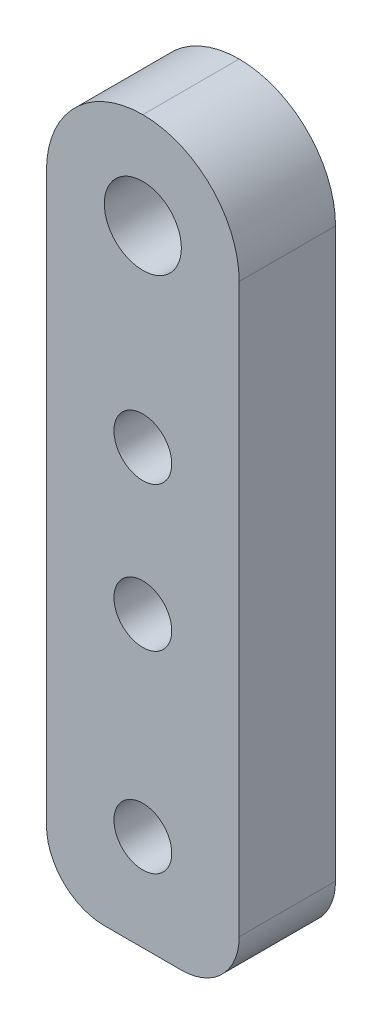
ISO-10303-21;
HEADER;
FILE_DESCRIPTION(('STEP AP214'),'2;1');
FILE_NAME('part.step','',(''),(''),'','','');
FILE_SCHEMA(('AUTOMOTIVE_DESIGN { 1 0 10303 214 1 1 1 1 }'));
ENDSEC;
DATA;
#1=APPLICATION_CONTEXT('core data for automotive mechanical design processes');
#2=APPLICATION_PROTOCOL_DEFINITION('international standard','automotive_design',2000,#1);
#3=PRODUCT_CONTEXT('',#1,'mechanical');
#4=PRODUCT('Part','Part','',(#3));
#5=PRODUCT_RELATED_PRODUCT_CATEGORY('part','',(#4));
#6=PRODUCT_DEFINITION_FORMATION('','',#4);
#7=PRODUCT_DEFINITION_CONTEXT('part definition',#1,'design');
#8=PRODUCT_DEFINITION('design','',#6,#7);
#9=PRODUCT_DEFINITION_SHAPE('','',#8);
#10=(LENGTH_UNIT() NAMED_UNIT(*) SI_UNIT(.MILLI.,.METRE.));
#11=(NAMED_UNIT(*) PLANE_ANGLE_UNIT() SI_UNIT($,.RADIAN.));
#12=(NAMED_UNIT(*) SI_UNIT($,.STERADIAN.) SOLID_ANGLE_UNIT());
#13=UNCERTAINTY_MEASURE_WITH_UNIT(LENGTH_MEASURE(1.E-05),#10,'distance_accuracy_value','');
#14=(GEOMETRIC_REPRESENTATION_CONTEXT(3) GLOBAL_UNCERTAINTY_ASSIGNED_CONTEXT((#13)) GLOBAL_UNIT_ASSIGNED_CONTEXT((#10,
#11,#12)) REPRESENTATION_CONTEXT('',''));
#15=CARTESIAN_POINT('',(0.,0.,0.));
#16=DIRECTION('',(0.,0.,1.));
#17=DIRECTION('',(1.,0.,0.));
#18=AXIS2_PLACEMENT_3D('',#15,#16,#17);
#19=CARTESIAN_POINT('',(0.,0.,5.));
#20=DIRECTION('',(0.,0.,-1.));
#21=DIRECTION('',(-1.,0.,0.));
#22=AXIS2_PLACEMENT_3D('',#19,#20,#21);
#23=PLANE('',#22);
#24=DIRECTION('',(0.,-1.,0.));
#25=VECTOR('',#24,1.);
#26=CARTESIAN_POINT('',(-5.,-18.725,5.));
#27=LINE('',#26,#25);
#28=CARTESIAN_POINT('',(-5.,13.725,5.));
#29=VERTEX_POINT('',#28);
#30=CARTESIAN_POINT('',(-5.,-15.725,5.));
#31=VERTEX_POINT('',#30);
#32=EDGE_CURVE('E118',#29,#31,#27,.T.);
#33=ORIENTED_EDGE('',*,*,#32,.T.);
#34=CARTESIAN_POINT('',(-2.,-15.725,5.));
#35=DIRECTION('',(0.,0.,-1.));
#36=DIRECTION('',(-1.,0.,0.));
#37=AXIS2_PLACEMENT_3D('',#34,#35,#36);
#38=CIRCLE('',#37,3.);
#39=CARTESIAN_POINT('',(-2.,-18.725,5.));
#40=VERTEX_POINT('',#39);
#41=EDGE_CURVE('E48',#31,#40,#38,.F.);
#42=ORIENTED_EDGE('',*,*,#41,.T.);
#43=DIRECTION('',(1.,0.,0.));
#44=VECTOR('',#43,1.);
#45=CARTESIAN_POINT('',(-5.,-18.725,5.));
#46=LINE('',#45,#44);
#47=CARTESIAN_POINT('',(2.,-18.725,5.));
#48=VERTEX_POINT('',#47);
#49=EDGE_CURVE('E119',#40,#48,#46,.T.);
#50=ORIENTED_EDGE('',*,*,#49,.T.);
#51=CARTESIAN_POINT('',(2.,-15.725,5.));
#52=DIRECTION('',(0.,0.,-1.));
#53=DIRECTION('',(-1.,0.,0.));
#54=AXIS2_PLACEMENT_3D('',#51,#52,#53);
#55=CIRCLE('',#54,3.);
#56=CARTESIAN_POINT('',(5.,-15.725,5.));
#57=VERTEX_POINT('',#56);
#58=EDGE_CURVE('E55',#48,#57,#55,.F.);
#59=ORIENTED_EDGE('',*,*,#58,.T.);
#60=DIRECTION('',(0.,1.,0.));
#61=VECTOR('',#60,1.);
#62=CARTESIAN_POINT('',(5.,-18.725,5.));
#63=LINE('',#62,#61);
#64=CARTESIAN_POINT('',(5.,13.725,5.));
#65=VERTEX_POINT('',#64);
#66=EDGE_CURVE('E129',#57,#65,#63,.T.);
#67=ORIENTED_EDGE('',*,*,#66,.T.);
#68=CARTESIAN_POINT('',(0.,13.725,5.));
#69=DIRECTION('',(0.,0.,-1.));
#70=DIRECTION('',(-1.,0.,0.));
#71=AXIS2_PLACEMENT_3D('',#68,#69,#70);
#72=CIRCLE('',#71,5.);
#73=CARTESIAN_POINT('',(0.,18.725,5.));
#74=VERTEX_POINT('',#73);
#75=EDGE_CURVE('E113',#65,#74,#72,.F.);
#76=ORIENTED_EDGE('',*,*,#75,.T.);
#77=CARTESIAN_POINT('',(0.,13.725,5.));
#78=DIRECTION('',(0.,0.,-1.));
#79=DIRECTION('',(-1.,0.,0.));
#80=AXIS2_PLACEMENT_3D('',#77,#78,#79);
#81=CIRCLE('',#80,5.);
#82=EDGE_CURVE('E138',#74,#29,#81,.F.);
#83=ORIENTED_EDGE('',*,*,#82,.T.);
#84=EDGE_LOOP('',(#33,#42,#50,#59,#67,#76,#83));
#85=FACE_BOUND('',#84,.T.);
#86=CARTESIAN_POINT('',(0.,-13.725,5.));
#87=DIRECTION('',(0.,0.,1.));
#88=DIRECTION('',(1.,0.,0.));
#89=AXIS2_PLACEMENT_3D('',#86,#87,#88);
#90=CIRCLE('',#89,1.5);
#91=CARTESIAN_POINT('',(1.5,-13.725,5.));
#92=VERTEX_POINT('',#91);
#93=EDGE_CURVE('E131',#92,#92,#90,.T.);
#94=ORIENTED_EDGE('',*,*,#93,.F.);
#95=EDGE_LOOP('',(#94));
#96=FACE_BOUND('',#95,.T.);
#97=CARTESIAN_POINT('',(0.,-3.725,5.));
#98=DIRECTION('',(0.,0.,1.));
#99=DIRECTION('',(1.,0.,0.));
#100=AXIS2_PLACEMENT_3D('',#97,#98,#99);
#101=CIRCLE('',#100,1.5);
#102=CARTESIAN_POINT('',(1.5,-3.725,5.));
#103=VERTEX_POINT('',#102);
#104=EDGE_CURVE('E228',#103,#103,#101,.T.);
#105=ORIENTED_EDGE('',*,*,#104,.F.);
#106=EDGE_LOOP('',(#105));
#107=FACE_BOUND('',#106,.T.);
#108=CARTESIAN_POINT('',(0.,13.725,5.));
#109=DIRECTION('',(0.,0.,1.));
#110=DIRECTION('',(1.,0.,0.));
#111=AXIS2_PLACEMENT_3D('',#108,#109,#110);
#112=CIRCLE('',#111,2.);
#113=CARTESIAN_POINT('',(2.,13.725,5.));
#114=VERTEX_POINT('',#113);
#115=EDGE_CURVE('E229',#114,#114,#112,.T.);
#116=ORIENTED_EDGE('',*,*,#115,.F.);
#117=EDGE_LOOP('',(#116));
#118=FACE_BOUND('',#117,.T.);
#119=CARTESIAN_POINT('',(0.,3.775,5.));
#120=DIRECTION('',(0.,0.,1.));
#121=DIRECTION('',(1.,0.,0.));
#122=AXIS2_PLACEMENT_3D('',#119,#120,#121);
#123=CIRCLE('',#122,1.5);
#124=CARTESIAN_POINT('',(1.5,3.775,5.));
#125=VERTEX_POINT('',#124);
#126=EDGE_CURVE('E237',#125,#125,#123,.T.);
#127=ORIENTED_EDGE('',*,*,#126,.F.);
#128=EDGE_LOOP('',(#127));
#129=FACE_BOUND('',#128,.T.);
#130=ADVANCED_FACE('F40',(#85,#96,#107,#118,#129),#23,.F.);
#131=CARTESIAN_POINT('',(0.,0.,0.));
#132=DIRECTION('',(0.,0.,-1.));
#133=DIRECTION('',(-1.,0.,0.));
#134=AXIS2_PLACEMENT_3D('',#131,#132,#133);
#135=PLANE('',#134);
#136=CARTESIAN_POINT('',(0.,13.725,0.));
#137=DIRECTION('',(0.,0.,1.));
#138=DIRECTION('',(1.,0.,0.));
#139=AXIS2_PLACEMENT_3D('',#136,#137,#138);
#140=CIRCLE('',#139,2.);
#141=CARTESIAN_POINT('',(2.,13.725,0.));
#142=VERTEX_POINT('',#141);
#143=EDGE_CURVE('E234',#142,#142,#140,.T.);
#144=ORIENTED_EDGE('',*,*,#143,.T.);
#145=EDGE_LOOP('',(#144));
#146=FACE_BOUND('',#145,.T.);
#147=CARTESIAN_POINT('',(0.,-13.725,0.));
#148=DIRECTION('',(0.,0.,1.));
#149=DIRECTION('',(1.,0.,0.));
#150=AXIS2_PLACEMENT_3D('',#147,#148,#149);
#151=CIRCLE('',#150,1.5);
#152=CARTESIAN_POINT('',(1.5,-13.725,0.));
#153=VERTEX_POINT('',#152);
#154=EDGE_CURVE('E213',#153,#153,#151,.T.);
#155=ORIENTED_EDGE('',*,*,#154,.T.);
#156=EDGE_LOOP('',(#155));
#157=FACE_BOUND('',#156,.T.);
#158=DIRECTION('',(1.,0.,0.));
#159=VECTOR('',#158,1.);
#160=CARTESIAN_POINT('',(-5.,-18.725,0.));
#161=LINE('',#160,#159);
#162=CARTESIAN_POINT('',(-2.,-18.725,0.));
#163=VERTEX_POINT('',#162);
#164=CARTESIAN_POINT('',(2.,-18.725,0.));
#165=VERTEX_POINT('',#164);
#166=EDGE_CURVE('E125',#163,#165,#161,.T.);
#167=ORIENTED_EDGE('',*,*,#166,.F.);
#168=CARTESIAN_POINT('',(-2.,-15.725,0.));
#169=DIRECTION('',(0.,0.,-1.));
#170=DIRECTION('',(-1.,0.,0.));
#171=AXIS2_PLACEMENT_3D('',#168,#169,#170);
#172=CIRCLE('',#171,3.);
#173=CARTESIAN_POINT('',(-5.,-15.725,0.));
#174=VERTEX_POINT('',#173);
#175=EDGE_CURVE('E124',#163,#174,#172,.T.);
#176=ORIENTED_EDGE('',*,*,#175,.T.);
#177=DIRECTION('',(0.,-1.,0.));
#178=VECTOR('',#177,1.);
#179=CARTESIAN_POINT('',(-5.,-18.725,0.));
#180=LINE('',#179,#178);
#181=CARTESIAN_POINT('',(-5.,13.725,0.));
#182=VERTEX_POINT('',#181);
#183=EDGE_CURVE('E117',#182,#174,#180,.T.);
#184=ORIENTED_EDGE('',*,*,#183,.F.);
#185=CARTESIAN_POINT('',(0.,13.725,0.));
#186=DIRECTION('',(0.,0.,-1.));
#187=DIRECTION('',(-1.,0.,0.));
#188=AXIS2_PLACEMENT_3D('',#185,#186,#187);
#189=CIRCLE('',#188,5.);
#190=CARTESIAN_POINT('',(0.,18.725,0.));
#191=VERTEX_POINT('',#190);
#192=EDGE_CURVE('E102',#182,#191,#189,.T.);
#193=ORIENTED_EDGE('',*,*,#192,.T.);
#194=CARTESIAN_POINT('',(0.,13.725,0.));
#195=DIRECTION('',(0.,0.,-1.));
#196=DIRECTION('',(-1.,0.,0.));
#197=AXIS2_PLACEMENT_3D('',#194,#195,#196);
#198=CIRCLE('',#197,5.);
#199=CARTESIAN_POINT('',(5.,13.725,0.));
#200=VERTEX_POINT('',#199);
#201=EDGE_CURVE('E114',#191,#200,#198,.T.);
#202=ORIENTED_EDGE('',*,*,#201,.T.);
#203=DIRECTION('',(0.,1.,0.));
#204=VECTOR('',#203,1.);
#205=CARTESIAN_POINT('',(5.,-18.725,0.));
#206=LINE('',#205,#204);
#207=CARTESIAN_POINT('',(5.,-15.725,0.));
#208=VERTEX_POINT('',#207);
#209=EDGE_CURVE('E126',#208,#200,#206,.T.);
#210=ORIENTED_EDGE('',*,*,#209,.F.);
#211=CARTESIAN_POINT('',(2.,-15.725,0.));
#212=DIRECTION('',(0.,0.,-1.));
#213=DIRECTION('',(-1.,0.,0.));
#214=AXIS2_PLACEMENT_3D('',#211,#212,#213);
#215=CIRCLE('',#214,3.);
#216=EDGE_CURVE('E151',#208,#165,#215,.T.);
#217=ORIENTED_EDGE('',*,*,#216,.T.);
#218=EDGE_LOOP('',(#167,#176,#184,#193,#202,#210,#217));
#219=FACE_BOUND('',#218,.T.);
#220=CARTESIAN_POINT('',(0.,-3.725,0.));
#221=DIRECTION('',(0.,0.,1.));
#222=DIRECTION('',(1.,0.,0.));
#223=AXIS2_PLACEMENT_3D('',#220,#221,#222);
#224=CIRCLE('',#223,1.5);
#225=CARTESIAN_POINT('',(1.5,-3.725,0.));
#226=VERTEX_POINT('',#225);
#227=EDGE_CURVE('E226',#226,#226,#224,.T.);
#228=ORIENTED_EDGE('',*,*,#227,.T.);
#229=EDGE_LOOP('',(#228));
#230=FACE_BOUND('',#229,.T.);
#231=CARTESIAN_POINT('',(0.,3.775,0.));
#232=DIRECTION('',(0.,0.,1.));
#233=DIRECTION('',(1.,0.,0.));
#234=AXIS2_PLACEMENT_3D('',#231,#232,#233);
#235=CIRCLE('',#234,1.5);
#236=CARTESIAN_POINT('',(1.5,3.775,0.));
#237=VERTEX_POINT('',#236);
#238=EDGE_CURVE('E146',#237,#237,#235,.T.);
#239=ORIENTED_EDGE('',*,*,#238,.T.);
#240=EDGE_LOOP('',(#239));
#241=FACE_BOUND('',#240,.T.);
#242=ADVANCED_FACE('F122',(#146,#157,#219,#230,#241),#135,.T.);
#243=CARTESIAN_POINT('',(5.,-18.725,5.));
#244=DIRECTION('',(-1.,0.,0.));
#245=DIRECTION('',(0.,-1.,0.));
#246=AXIS2_PLACEMENT_3D('',#243,#244,#245);
#247=PLANE('',#246);
#248=ORIENTED_EDGE('',*,*,#66,.F.);
#249=DIRECTION('',(0.,0.,-1.));
#250=VECTOR('',#249,1.);
#251=CARTESIAN_POINT('',(5.,-15.725,5.));
#252=LINE('',#251,#250);
#253=EDGE_CURVE('E12',#57,#208,#252,.T.);
#254=ORIENTED_EDGE('',*,*,#253,.T.);
#255=ORIENTED_EDGE('',*,*,#209,.T.);
#256=DIRECTION('',(0.,0.,-1.));
#257=VECTOR('',#256,1.);
#258=CARTESIAN_POINT('',(5.,13.725,5.));
#259=LINE('',#258,#257);
#260=EDGE_CURVE('E141',#200,#65,#259,.F.);
#261=ORIENTED_EDGE('',*,*,#260,.T.);
#262=EDGE_LOOP('',(#248,#254,#255,#261));
#263=FACE_BOUND('',#262,.T.);
#264=ADVANCED_FACE('F182',(#263),#247,.F.);
#265=CARTESIAN_POINT('',(-5.,-18.725,5.));
#266=DIRECTION('',(1.,0.,0.));
#267=DIRECTION('',(0.,0.,-1.));
#268=AXIS2_PLACEMENT_3D('',#265,#266,#267);
#269=PLANE('',#268);
#270=ORIENTED_EDGE('',*,*,#183,.T.);
#271=DIRECTION('',(0.,0.,-1.));
#272=VECTOR('',#271,1.);
#273=CARTESIAN_POINT('',(-5.,-15.725,5.));
#274=LINE('',#273,#272);
#275=EDGE_CURVE('E63',#174,#31,#274,.F.);
#276=ORIENTED_EDGE('',*,*,#275,.T.);
#277=ORIENTED_EDGE('',*,*,#32,.F.);
#278=DIRECTION('',(0.,0.,-1.));
#279=VECTOR('',#278,1.);
#280=CARTESIAN_POINT('',(-5.,13.725,5.));
#281=LINE('',#280,#279);
#282=EDGE_CURVE('E106',#29,#182,#281,.T.);
#283=ORIENTED_EDGE('',*,*,#282,.T.);
#284=EDGE_LOOP('',(#270,#276,#277,#283));
#285=FACE_BOUND('',#284,.T.);
#286=ADVANCED_FACE('F116',(#285),#269,.F.);
#287=CARTESIAN_POINT('',(-5.,-18.725,5.));
#288=DIRECTION('',(0.,1.,0.));
#289=DIRECTION('',(0.,0.,1.));
#290=AXIS2_PLACEMENT_3D('',#287,#288,#289);
#291=PLANE('',#290);
#292=ORIENTED_EDGE('',*,*,#49,.F.);
#293=DIRECTION('',(0.,0.,-1.));
#294=VECTOR('',#293,1.);
#295=CARTESIAN_POINT('',(-2.,-18.725,5.));
#296=LINE('',#295,#294);
#297=EDGE_CURVE('E148',#40,#163,#296,.T.);
#298=ORIENTED_EDGE('',*,*,#297,.T.);
#299=ORIENTED_EDGE('',*,*,#166,.T.);
#300=DIRECTION('',(0.,0.,-1.));
#301=VECTOR('',#300,1.);
#302=CARTESIAN_POINT('',(2.,-18.725,5.));
#303=LINE('',#302,#301);
#304=EDGE_CURVE('E144',#165,#48,#303,.F.);
#305=ORIENTED_EDGE('',*,*,#304,.T.);
#306=EDGE_LOOP('',(#292,#298,#299,#305));
#307=FACE_BOUND('',#306,.T.);
#308=ADVANCED_FACE('F165',(#307),#291,.F.);
#309=CARTESIAN_POINT('',(0.,-13.725,5.));
#310=DIRECTION('',(0.,0.,-1.));
#311=DIRECTION('',(-1.,0.,0.));
#312=AXIS2_PLACEMENT_3D('',#309,#310,#311);
#313=CYLINDRICAL_SURFACE('',#312,1.5);
#314=ORIENTED_EDGE('',*,*,#93,.T.);
#315=EDGE_LOOP('',(#314));
#316=FACE_BOUND('',#315,.T.);
#317=ORIENTED_EDGE('',*,*,#154,.F.);
#318=EDGE_LOOP('',(#317));
#319=FACE_BOUND('',#318,.T.);
#320=ADVANCED_FACE('F186',(#316,#319),#313,.F.);
#321=CARTESIAN_POINT('',(0.,-3.725,5.));
#322=DIRECTION('',(0.,0.,-1.));
#323=DIRECTION('',(-1.,0.,0.));
#324=AXIS2_PLACEMENT_3D('',#321,#322,#323);
#325=CYLINDRICAL_SURFACE('',#324,1.5);
#326=ORIENTED_EDGE('',*,*,#104,.T.);
#327=EDGE_LOOP('',(#326));
#328=FACE_BOUND('',#327,.T.);
#329=ORIENTED_EDGE('',*,*,#227,.F.);
#330=EDGE_LOOP('',(#329));
#331=FACE_BOUND('',#330,.T.);
#332=ADVANCED_FACE('F256',(#328,#331),#325,.F.);
#333=CARTESIAN_POINT('',(0.,13.725,5.));
#334=DIRECTION('',(0.,0.,-1.));
#335=DIRECTION('',(-1.,0.,0.));
#336=AXIS2_PLACEMENT_3D('',#333,#334,#335);
#337=CYLINDRICAL_SURFACE('',#336,2.);
#338=ORIENTED_EDGE('',*,*,#115,.T.);
#339=EDGE_LOOP('',(#338));
#340=FACE_BOUND('',#339,.T.);
#341=ORIENTED_EDGE('',*,*,#143,.F.);
#342=EDGE_LOOP('',(#341));
#343=FACE_BOUND('',#342,.T.);
#344=ADVANCED_FACE('F201',(#340,#343),#337,.F.);
#345=CARTESIAN_POINT('',(0.,3.775,5.));
#346=DIRECTION('',(0.,0.,-1.));
#347=DIRECTION('',(-1.,0.,0.));
#348=AXIS2_PLACEMENT_3D('',#345,#346,#347);
#349=CYLINDRICAL_SURFACE('',#348,1.5);
#350=ORIENTED_EDGE('',*,*,#126,.T.);
#351=EDGE_LOOP('',(#350));
#352=FACE_BOUND('',#351,.T.);
#353=ORIENTED_EDGE('',*,*,#238,.F.);
#354=EDGE_LOOP('',(#353));
#355=FACE_BOUND('',#354,.T.);
#356=ADVANCED_FACE('F196',(#352,#355),#349,.F.);
#357=CARTESIAN_POINT('',(0.,13.725,5.));
#358=DIRECTION('',(0.,0.,-1.));
#359=DIRECTION('',(-1.,0.,0.));
#360=AXIS2_PLACEMENT_3D('',#357,#358,#359);
#361=CYLINDRICAL_SURFACE('',#360,5.);
#362=DIRECTION('',(0.,0.,-1.));
#363=VECTOR('',#362,1.);
#364=CARTESIAN_POINT('',(0.,18.725,5.));
#365=LINE('',#364,#363);
#366=EDGE_CURVE('E108',#74,#191,#365,.T.);
#367=ORIENTED_EDGE('',*,*,#366,.F.);
#368=ORIENTED_EDGE('',*,*,#75,.F.);
#369=ORIENTED_EDGE('',*,*,#260,.F.);
#370=ORIENTED_EDGE('',*,*,#201,.F.);
#371=EDGE_LOOP('',(#367,#368,#369,#370));
#372=FACE_BOUND('',#371,.T.);
#373=ADVANCED_FACE('F174',(#372),#361,.T.);
#374=CARTESIAN_POINT('',(0.,13.725,5.));
#375=DIRECTION('',(0.,0.,-1.));
#376=DIRECTION('',(-1.,0.,0.));
#377=AXIS2_PLACEMENT_3D('',#374,#375,#376);
#378=CYLINDRICAL_SURFACE('',#377,5.);
#379=ORIENTED_EDGE('',*,*,#82,.F.);
#380=ORIENTED_EDGE('',*,*,#366,.T.);
#381=ORIENTED_EDGE('',*,*,#192,.F.);
#382=ORIENTED_EDGE('',*,*,#282,.F.);
#383=EDGE_LOOP('',(#379,#380,#381,#382));
#384=FACE_BOUND('',#383,.T.);
#385=ADVANCED_FACE('F105',(#384),#378,.T.);
#386=CARTESIAN_POINT('',(-2.,-15.725,5.));
#387=DIRECTION('',(0.,0.,-1.));
#388=DIRECTION('',(-1.,0.,0.));
#389=AXIS2_PLACEMENT_3D('',#386,#387,#388);
#390=CYLINDRICAL_SURFACE('',#389,3.);
#391=ORIENTED_EDGE('',*,*,#41,.F.);
#392=ORIENTED_EDGE('',*,*,#275,.F.);
#393=ORIENTED_EDGE('',*,*,#175,.F.);
#394=ORIENTED_EDGE('',*,*,#297,.F.);
#395=EDGE_LOOP('',(#391,#392,#393,#394));
#396=FACE_BOUND('',#395,.T.);
#397=ADVANCED_FACE('F167',(#396),#390,.T.);
#398=CARTESIAN_POINT('',(2.,-15.725,5.));
#399=DIRECTION('',(0.,0.,-1.));
#400=DIRECTION('',(-1.,0.,0.));
#401=AXIS2_PLACEMENT_3D('',#398,#399,#400);
#402=CYLINDRICAL_SURFACE('',#401,3.);
#403=ORIENTED_EDGE('',*,*,#58,.F.);
#404=ORIENTED_EDGE('',*,*,#304,.F.);
#405=ORIENTED_EDGE('',*,*,#216,.F.);
#406=ORIENTED_EDGE('',*,*,#253,.F.);
#407=EDGE_LOOP('',(#403,#404,#405,#406));
#408=FACE_BOUND('',#407,.T.);
#409=ADVANCED_FACE('F42',(#408),#402,.T.);
#410=CLOSED_SHELL('',(#130,#242,#264,#286,#308,#320,#332,#344,#356,#373,#385,#397,#409));
#411=MANIFOLD_SOLID_BREP('B2',#410);
#412=ADVANCED_BREP_SHAPE_REPRESENTATION('',(#18,#411),#14);
#413=SHAPE_DEFINITION_REPRESENTATION(#9,#412);
ENDSEC;
END-ISO-10303-21;
